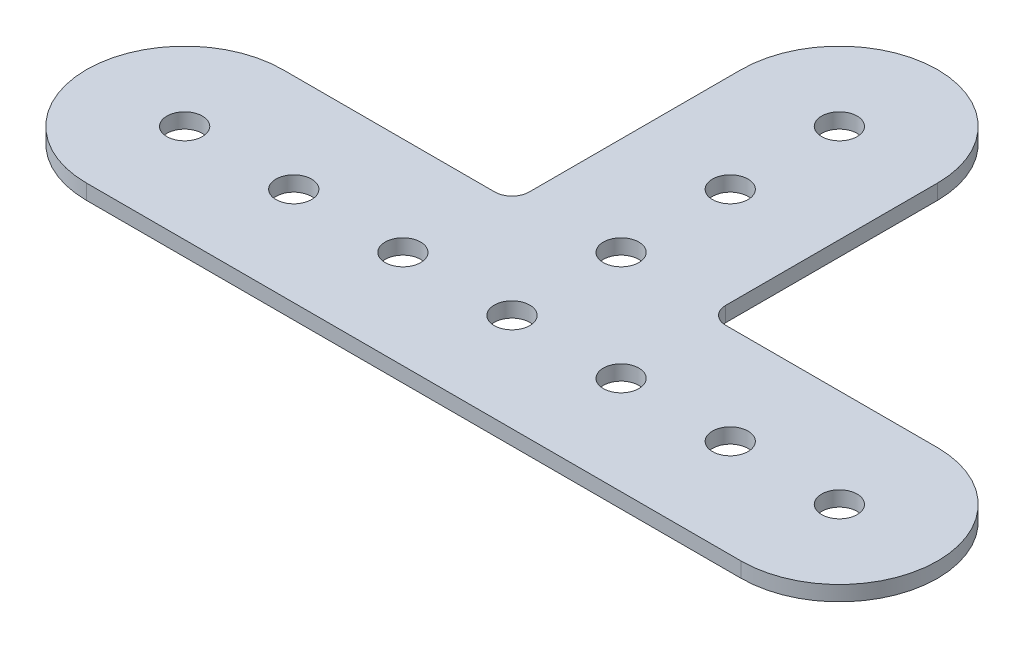
ISO-10303-21;
HEADER;
FILE_DESCRIPTION(('STEP AP214'),'2;1');
FILE_NAME('part.step','',(''),(''),'','','');
FILE_SCHEMA(('AUTOMOTIVE_DESIGN { 1 0 10303 214 1 1 1 1 }'));
ENDSEC;
DATA;
#1=APPLICATION_CONTEXT('core data for automotive mechanical design processes');
#2=APPLICATION_PROTOCOL_DEFINITION('international standard','automotive_design',2000,#1);
#3=PRODUCT_CONTEXT('',#1,'mechanical');
#4=PRODUCT('Part','Part','',(#3));
#5=PRODUCT_RELATED_PRODUCT_CATEGORY('part','',(#4));
#6=PRODUCT_DEFINITION_FORMATION('','',#4);
#7=PRODUCT_DEFINITION_CONTEXT('part definition',#1,'design');
#8=PRODUCT_DEFINITION('design','',#6,#7);
#9=PRODUCT_DEFINITION_SHAPE('','',#8);
#10=(LENGTH_UNIT() NAMED_UNIT(*) SI_UNIT(.MILLI.,.METRE.));
#11=(NAMED_UNIT(*) PLANE_ANGLE_UNIT() SI_UNIT($,.RADIAN.));
#12=(NAMED_UNIT(*) SI_UNIT($,.STERADIAN.) SOLID_ANGLE_UNIT());
#13=UNCERTAINTY_MEASURE_WITH_UNIT(LENGTH_MEASURE(1.E-05),#10,'distance_accuracy_value','');
#14=(GEOMETRIC_REPRESENTATION_CONTEXT(3) GLOBAL_UNCERTAINTY_ASSIGNED_CONTEXT((#13)) GLOBAL_UNIT_ASSIGNED_CONTEXT((#10,
#11,#12)) REPRESENTATION_CONTEXT('',''));
#15=CARTESIAN_POINT('',(0.,0.,0.));
#16=DIRECTION('',(0.,0.,1.));
#17=DIRECTION('',(1.,0.,0.));
#18=AXIS2_PLACEMENT_3D('',#15,#16,#17);
#19=CARTESIAN_POINT('',(11.4299999999999,0.875,0.));
#20=DIRECTION('',(1.,0.,0.));
#21=DIRECTION('',(0.,0.,-1.));
#22=AXIS2_PLACEMENT_3D('',#19,#20,#21);
#23=PLANE('',#22);
#24=DIRECTION('',(0.,0.,1.));
#25=VECTOR('',#24,1.);
#26=CARTESIAN_POINT('',(11.4299999999999,0.875,0.));
#27=LINE('',#26,#25);
#28=CARTESIAN_POINT('',(11.4299999999999,0.875,-38.1));
#29=VERTEX_POINT('',#28);
#30=CARTESIAN_POINT('',(11.4299999999999,0.875,-13.43));
#31=VERTEX_POINT('',#30);
#32=EDGE_CURVE('E119',#29,#31,#27,.T.);
#33=ORIENTED_EDGE('',*,*,#32,.T.);
#34=DIRECTION('',(0.,-1.,0.));
#35=VECTOR('',#34,1.);
#36=CARTESIAN_POINT('',(11.4299999999999,-0.875,-13.43));
#37=LINE('',#36,#35);
#38=CARTESIAN_POINT('',(11.4299999999999,-0.875,-13.43));
#39=VERTEX_POINT('',#38);
#40=EDGE_CURVE('E289',#31,#39,#37,.T.);
#41=ORIENTED_EDGE('',*,*,#40,.T.);
#42=DIRECTION('',(0.,0.,1.));
#43=VECTOR('',#42,1.);
#44=CARTESIAN_POINT('',(11.4299999999999,-0.875,0.));
#45=LINE('',#44,#43);
#46=CARTESIAN_POINT('',(11.4299999999999,-0.875,-38.1));
#47=VERTEX_POINT('',#46);
#48=EDGE_CURVE('E121',#47,#39,#45,.T.);
#49=ORIENTED_EDGE('',*,*,#48,.F.);
#50=DIRECTION('',(0.,-1.,0.));
#51=VECTOR('',#50,1.);
#52=CARTESIAN_POINT('',(11.4299999999999,0.875,-38.1));
#53=LINE('',#52,#51);
#54=EDGE_CURVE('E115',#29,#47,#53,.T.);
#55=ORIENTED_EDGE('',*,*,#54,.F.);
#56=EDGE_LOOP('',(#33,#41,#49,#55));
#57=FACE_BOUND('',#56,.T.);
#58=ADVANCED_FACE('F39',(#57),#23,.T.);
#59=CARTESIAN_POINT('',(-1.30692486857548E-13,0.875,-38.1));
#60=DIRECTION('',(0.,-1.,0.));
#61=DIRECTION('',(0.,0.,-1.));
#62=AXIS2_PLACEMENT_3D('',#59,#60,#61);
#63=CYLINDRICAL_SURFACE('',#62,11.43);
#64=CARTESIAN_POINT('',(-1.30692486857548E-13,-0.875,-38.1));
#65=DIRECTION('',(0.,1.,0.));
#66=DIRECTION('',(0.,0.,1.));
#67=AXIS2_PLACEMENT_3D('',#64,#65,#66);
#68=CIRCLE('',#67,11.43);
#69=CARTESIAN_POINT('',(-11.4300000000001,-0.875,-38.1));
#70=VERTEX_POINT('',#69);
#71=EDGE_CURVE('E210',#47,#70,#68,.T.);
#72=ORIENTED_EDGE('',*,*,#71,.T.);
#73=DIRECTION('',(0.,-1.,0.));
#74=VECTOR('',#73,1.);
#75=CARTESIAN_POINT('',(-11.4300000000001,0.875,-38.1));
#76=LINE('',#75,#74);
#77=CARTESIAN_POINT('',(-11.4300000000001,0.875,-38.1));
#78=VERTEX_POINT('',#77);
#79=EDGE_CURVE('E126',#78,#70,#76,.T.);
#80=ORIENTED_EDGE('',*,*,#79,.F.);
#81=CARTESIAN_POINT('',(-1.30692486857548E-13,0.875,-38.1));
#82=DIRECTION('',(0.,1.,0.));
#83=DIRECTION('',(0.,0.,1.));
#84=AXIS2_PLACEMENT_3D('',#81,#82,#83);
#85=CIRCLE('',#84,11.43);
#86=EDGE_CURVE('E129',#29,#78,#85,.T.);
#87=ORIENTED_EDGE('',*,*,#86,.F.);
#88=ORIENTED_EDGE('',*,*,#54,.T.);
#89=EDGE_LOOP('',(#72,#80,#87,#88));
#90=FACE_BOUND('',#89,.T.);
#91=ADVANCED_FACE('F130',(#90),#63,.T.);
#92=CARTESIAN_POINT('',(-11.4300000000001,0.875,0.));
#93=DIRECTION('',(1.,0.,0.));
#94=DIRECTION('',(0.,0.,-1.));
#95=AXIS2_PLACEMENT_3D('',#92,#93,#94);
#96=PLANE('',#95);
#97=DIRECTION('',(0.,0.,1.));
#98=VECTOR('',#97,1.);
#99=CARTESIAN_POINT('',(-11.4300000000001,-0.875,0.));
#100=LINE('',#99,#98);
#101=CARTESIAN_POINT('',(-11.4300000000001,-0.875,-13.43));
#102=VERTEX_POINT('',#101);
#103=EDGE_CURVE('E213',#70,#102,#100,.T.);
#104=ORIENTED_EDGE('',*,*,#103,.T.);
#105=DIRECTION('',(0.,-1.,0.));
#106=VECTOR('',#105,1.);
#107=CARTESIAN_POINT('',(-11.4300000000001,0.875,-13.43));
#108=LINE('',#107,#106);
#109=CARTESIAN_POINT('',(-11.4300000000001,0.875,-13.43));
#110=VERTEX_POINT('',#109);
#111=EDGE_CURVE('E286',#102,#110,#108,.F.);
#112=ORIENTED_EDGE('',*,*,#111,.T.);
#113=DIRECTION('',(0.,0.,1.));
#114=VECTOR('',#113,1.);
#115=CARTESIAN_POINT('',(-11.4300000000001,0.875,0.));
#116=LINE('',#115,#114);
#117=EDGE_CURVE('E136',#78,#110,#116,.T.);
#118=ORIENTED_EDGE('',*,*,#117,.F.);
#119=ORIENTED_EDGE('',*,*,#79,.T.);
#120=EDGE_LOOP('',(#104,#112,#118,#119));
#121=FACE_BOUND('',#120,.T.);
#122=ADVANCED_FACE('F318',(#121),#96,.F.);
#123=CARTESIAN_POINT('',(0.,0.875,-11.43));
#124=DIRECTION('',(0.,0.,-1.));
#125=DIRECTION('',(-1.,0.,0.));
#126=AXIS2_PLACEMENT_3D('',#123,#124,#125);
#127=PLANE('',#126);
#128=DIRECTION('',(1.,0.,0.));
#129=VECTOR('',#128,1.);
#130=CARTESIAN_POINT('',(0.,0.875,-11.43));
#131=LINE('',#130,#129);
#132=CARTESIAN_POINT('',(-38.1,0.875,-11.43));
#133=VERTEX_POINT('',#132);
#134=CARTESIAN_POINT('',(-13.4300000000001,0.875,-11.43));
#135=VERTEX_POINT('',#134);
#136=EDGE_CURVE('E151',#133,#135,#131,.T.);
#137=ORIENTED_EDGE('',*,*,#136,.T.);
#138=DIRECTION('',(0.,-1.,0.));
#139=VECTOR('',#138,1.);
#140=CARTESIAN_POINT('',(-13.4300000000001,0.875,-11.43));
#141=LINE('',#140,#139);
#142=CARTESIAN_POINT('',(-13.4300000000001,-0.875,-11.43));
#143=VERTEX_POINT('',#142);
#144=EDGE_CURVE('E125',#135,#143,#141,.T.);
#145=ORIENTED_EDGE('',*,*,#144,.T.);
#146=DIRECTION('',(1.,0.,0.));
#147=VECTOR('',#146,1.);
#148=CARTESIAN_POINT('',(0.,-0.875,-11.43));
#149=LINE('',#148,#147);
#150=CARTESIAN_POINT('',(-38.1,-0.875,-11.43));
#151=VERTEX_POINT('',#150);
#152=EDGE_CURVE('E217',#151,#143,#149,.T.);
#153=ORIENTED_EDGE('',*,*,#152,.F.);
#154=DIRECTION('',(0.,-1.,0.));
#155=VECTOR('',#154,1.);
#156=CARTESIAN_POINT('',(-38.1,0.875,-11.43));
#157=LINE('',#156,#155);
#158=EDGE_CURVE('E278',#133,#151,#157,.T.);
#159=ORIENTED_EDGE('',*,*,#158,.F.);
#160=EDGE_LOOP('',(#137,#145,#153,#159));
#161=FACE_BOUND('',#160,.T.);
#162=ADVANCED_FACE('F327',(#161),#127,.T.);
#163=CARTESIAN_POINT('',(-38.1,0.875,0.));
#164=DIRECTION('',(0.,-1.,0.));
#165=DIRECTION('',(0.,0.,-1.));
#166=AXIS2_PLACEMENT_3D('',#163,#164,#165);
#167=CYLINDRICAL_SURFACE('',#166,11.43);
#168=CARTESIAN_POINT('',(-38.1,-0.875,0.));
#169=DIRECTION('',(0.,1.,0.));
#170=DIRECTION('',(0.,0.,1.));
#171=AXIS2_PLACEMENT_3D('',#168,#169,#170);
#172=CIRCLE('',#171,11.43);
#173=CARTESIAN_POINT('',(-38.1,-0.875,11.43));
#174=VERTEX_POINT('',#173);
#175=EDGE_CURVE('E221',#174,#151,#172,.F.);
#176=ORIENTED_EDGE('',*,*,#175,.F.);
#177=DIRECTION('',(0.,-1.,0.));
#178=VECTOR('',#177,1.);
#179=CARTESIAN_POINT('',(-38.1,0.875,11.43));
#180=LINE('',#179,#178);
#181=CARTESIAN_POINT('',(-38.1,0.875,11.43));
#182=VERTEX_POINT('',#181);
#183=EDGE_CURVE('E275',#182,#174,#180,.T.);
#184=ORIENTED_EDGE('',*,*,#183,.F.);
#185=CARTESIAN_POINT('',(-38.1,0.875,0.));
#186=DIRECTION('',(0.,1.,0.));
#187=DIRECTION('',(0.,0.,1.));
#188=AXIS2_PLACEMENT_3D('',#185,#186,#187);
#189=CIRCLE('',#188,11.43);
#190=EDGE_CURVE('E155',#182,#133,#189,.F.);
#191=ORIENTED_EDGE('',*,*,#190,.T.);
#192=ORIENTED_EDGE('',*,*,#158,.T.);
#193=EDGE_LOOP('',(#176,#184,#191,#192));
#194=FACE_BOUND('',#193,.T.);
#195=ADVANCED_FACE('F329',(#194),#167,.T.);
#196=CARTESIAN_POINT('',(0.,0.875,11.43));
#197=DIRECTION('',(0.,0.,-1.));
#198=DIRECTION('',(-1.,0.,0.));
#199=AXIS2_PLACEMENT_3D('',#196,#197,#198);
#200=PLANE('',#199);
#201=DIRECTION('',(1.,0.,0.));
#202=VECTOR('',#201,1.);
#203=CARTESIAN_POINT('',(0.,-0.875,11.43));
#204=LINE('',#203,#202);
#205=CARTESIAN_POINT('',(38.1,-0.875,11.43));
#206=VERTEX_POINT('',#205);
#207=EDGE_CURVE('E226',#174,#206,#204,.T.);
#208=ORIENTED_EDGE('',*,*,#207,.T.);
#209=DIRECTION('',(0.,-1.,0.));
#210=VECTOR('',#209,1.);
#211=CARTESIAN_POINT('',(38.1,0.875,11.43));
#212=LINE('',#211,#210);
#213=CARTESIAN_POINT('',(38.1,0.875,11.43));
#214=VERTEX_POINT('',#213);
#215=EDGE_CURVE('E271',#214,#206,#212,.T.);
#216=ORIENTED_EDGE('',*,*,#215,.F.);
#217=DIRECTION('',(1.,0.,0.));
#218=VECTOR('',#217,1.);
#219=CARTESIAN_POINT('',(0.,0.875,11.43));
#220=LINE('',#219,#218);
#221=EDGE_CURVE('E160',#182,#214,#220,.T.);
#222=ORIENTED_EDGE('',*,*,#221,.F.);
#223=ORIENTED_EDGE('',*,*,#183,.T.);
#224=EDGE_LOOP('',(#208,#216,#222,#223));
#225=FACE_BOUND('',#224,.T.);
#226=ADVANCED_FACE('F331',(#225),#200,.F.);
#227=CARTESIAN_POINT('',(38.1,0.875,0.));
#228=DIRECTION('',(0.,-1.,0.));
#229=DIRECTION('',(0.,0.,-1.));
#230=AXIS2_PLACEMENT_3D('',#227,#228,#229);
#231=CYLINDRICAL_SURFACE('',#230,11.43);
#232=CARTESIAN_POINT('',(38.1,-0.875,0.));
#233=DIRECTION('',(0.,1.,0.));
#234=DIRECTION('',(0.,0.,1.));
#235=AXIS2_PLACEMENT_3D('',#232,#233,#234);
#236=CIRCLE('',#235,11.43);
#237=CARTESIAN_POINT('',(38.1,-0.875,-11.43));
#238=VERTEX_POINT('',#237);
#239=EDGE_CURVE('E229',#206,#238,#236,.T.);
#240=ORIENTED_EDGE('',*,*,#239,.T.);
#241=DIRECTION('',(0.,-1.,0.));
#242=VECTOR('',#241,1.);
#243=CARTESIAN_POINT('',(38.1,0.875,-11.43));
#244=LINE('',#243,#242);
#245=CARTESIAN_POINT('',(38.1,0.875,-11.43));
#246=VERTEX_POINT('',#245);
#247=EDGE_CURVE('E207',#246,#238,#244,.T.);
#248=ORIENTED_EDGE('',*,*,#247,.F.);
#249=CARTESIAN_POINT('',(38.1,0.875,0.));
#250=DIRECTION('',(0.,1.,0.));
#251=DIRECTION('',(0.,0.,1.));
#252=AXIS2_PLACEMENT_3D('',#249,#250,#251);
#253=CIRCLE('',#252,11.43);
#254=EDGE_CURVE('E163',#214,#246,#253,.T.);
#255=ORIENTED_EDGE('',*,*,#254,.F.);
#256=ORIENTED_EDGE('',*,*,#215,.T.);
#257=EDGE_LOOP('',(#240,#248,#255,#256));
#258=FACE_BOUND('',#257,.T.);
#259=ADVANCED_FACE('F308',(#258),#231,.T.);
#260=CARTESIAN_POINT('',(38.1,0.875,0.));
#261=DIRECTION('',(0.,-1.,0.));
#262=DIRECTION('',(0.,0.,-1.));
#263=AXIS2_PLACEMENT_3D('',#260,#261,#262);
#264=CYLINDRICAL_SURFACE('',#263,2.07);
#265=CARTESIAN_POINT('',(38.1,0.875,0.));
#266=DIRECTION('',(0.,1.,0.));
#267=DIRECTION('',(0.,0.,1.));
#268=AXIS2_PLACEMENT_3D('',#265,#266,#267);
#269=CIRCLE('',#268,2.07);
#270=CARTESIAN_POINT('',(38.1,0.875,2.07));
#271=VERTEX_POINT('',#270);
#272=EDGE_CURVE('E199',#271,#271,#269,.T.);
#273=ORIENTED_EDGE('',*,*,#272,.T.);
#274=EDGE_LOOP('',(#273));
#275=FACE_BOUND('',#274,.T.);
#276=CARTESIAN_POINT('',(38.1,-0.875,0.));
#277=DIRECTION('',(0.,1.,0.));
#278=DIRECTION('',(0.,0.,1.));
#279=AXIS2_PLACEMENT_3D('',#276,#277,#278);
#280=CIRCLE('',#279,2.07);
#281=CARTESIAN_POINT('',(38.1,-0.875,2.07));
#282=VERTEX_POINT('',#281);
#283=EDGE_CURVE('E146',#282,#282,#280,.T.);
#284=ORIENTED_EDGE('',*,*,#283,.F.);
#285=EDGE_LOOP('',(#284));
#286=FACE_BOUND('',#285,.T.);
#287=ADVANCED_FACE('F338',(#275,#286),#264,.F.);
#288=CARTESIAN_POINT('',(-12.7,0.875,0.));
#289=DIRECTION('',(0.,-1.,0.));
#290=DIRECTION('',(0.,0.,-1.));
#291=AXIS2_PLACEMENT_3D('',#288,#289,#290);
#292=CYLINDRICAL_SURFACE('',#291,2.07);
#293=CARTESIAN_POINT('',(-12.7,0.875,0.));
#294=DIRECTION('',(0.,1.,0.));
#295=DIRECTION('',(0.,0.,1.));
#296=AXIS2_PLACEMENT_3D('',#293,#294,#295);
#297=CIRCLE('',#296,2.07);
#298=CARTESIAN_POINT('',(-12.7,0.875,2.07));
#299=VERTEX_POINT('',#298);
#300=EDGE_CURVE('E195',#299,#299,#297,.F.);
#301=ORIENTED_EDGE('',*,*,#300,.F.);
#302=EDGE_LOOP('',(#301));
#303=FACE_BOUND('',#302,.T.);
#304=CARTESIAN_POINT('',(-12.7,-0.875,0.));
#305=DIRECTION('',(0.,1.,0.));
#306=DIRECTION('',(0.,0.,1.));
#307=AXIS2_PLACEMENT_3D('',#304,#305,#306);
#308=CIRCLE('',#307,2.07);
#309=CARTESIAN_POINT('',(-12.7,-0.875,2.07));
#310=VERTEX_POINT('',#309);
#311=EDGE_CURVE('E261',#310,#310,#308,.F.);
#312=ORIENTED_EDGE('',*,*,#311,.T.);
#313=EDGE_LOOP('',(#312));
#314=FACE_BOUND('',#313,.T.);
#315=ADVANCED_FACE('F365',(#303,#314),#292,.F.);
#316=CARTESIAN_POINT('',(12.7,0.875,0.));
#317=DIRECTION('',(0.,-1.,0.));
#318=DIRECTION('',(0.,0.,-1.));
#319=AXIS2_PLACEMENT_3D('',#316,#317,#318);
#320=CYLINDRICAL_SURFACE('',#319,2.07);
#321=CARTESIAN_POINT('',(12.7,0.875,0.));
#322=DIRECTION('',(0.,1.,0.));
#323=DIRECTION('',(0.,0.,1.));
#324=AXIS2_PLACEMENT_3D('',#321,#322,#323);
#325=CIRCLE('',#324,2.07);
#326=CARTESIAN_POINT('',(12.7,0.875,2.07));
#327=VERTEX_POINT('',#326);
#328=EDGE_CURVE('E191',#327,#327,#325,.T.);
#329=ORIENTED_EDGE('',*,*,#328,.T.);
#330=EDGE_LOOP('',(#329));
#331=FACE_BOUND('',#330,.T.);
#332=CARTESIAN_POINT('',(12.7,-0.875,0.));
#333=DIRECTION('',(0.,1.,0.));
#334=DIRECTION('',(0.,0.,1.));
#335=AXIS2_PLACEMENT_3D('',#332,#333,#334);
#336=CIRCLE('',#335,2.07);
#337=CARTESIAN_POINT('',(12.7,-0.875,2.07));
#338=VERTEX_POINT('',#337);
#339=EDGE_CURVE('E257',#338,#338,#336,.T.);
#340=ORIENTED_EDGE('',*,*,#339,.F.);
#341=EDGE_LOOP('',(#340));
#342=FACE_BOUND('',#341,.T.);
#343=ADVANCED_FACE('F369',(#331,#342),#320,.F.);
#344=CARTESIAN_POINT('',(0.,0.875,0.));
#345=DIRECTION('',(0.,-1.,0.));
#346=DIRECTION('',(0.,0.,-1.));
#347=AXIS2_PLACEMENT_3D('',#344,#345,#346);
#348=CYLINDRICAL_SURFACE('',#347,2.07);
#349=CARTESIAN_POINT('',(0.,0.875,0.));
#350=DIRECTION('',(0.,1.,0.));
#351=DIRECTION('',(0.,0.,1.));
#352=AXIS2_PLACEMENT_3D('',#349,#350,#351);
#353=CIRCLE('',#352,2.07);
#354=CARTESIAN_POINT('',(0.,0.875,2.07));
#355=VERTEX_POINT('',#354);
#356=EDGE_CURVE('E187',#355,#355,#353,.T.);
#357=ORIENTED_EDGE('',*,*,#356,.T.);
#358=EDGE_LOOP('',(#357));
#359=FACE_BOUND('',#358,.T.);
#360=CARTESIAN_POINT('',(0.,-0.875,0.));
#361=DIRECTION('',(0.,1.,0.));
#362=DIRECTION('',(0.,0.,1.));
#363=AXIS2_PLACEMENT_3D('',#360,#361,#362);
#364=CIRCLE('',#363,2.07);
#365=CARTESIAN_POINT('',(0.,-0.875,2.07));
#366=VERTEX_POINT('',#365);
#367=EDGE_CURVE('E253',#366,#366,#364,.T.);
#368=ORIENTED_EDGE('',*,*,#367,.F.);
#369=EDGE_LOOP('',(#368));
#370=FACE_BOUND('',#369,.T.);
#371=ADVANCED_FACE('F373',(#359,#370),#348,.F.);
#372=CARTESIAN_POINT('',(-38.1,0.875,0.));
#373=DIRECTION('',(0.,-1.,0.));
#374=DIRECTION('',(0.,0.,-1.));
#375=AXIS2_PLACEMENT_3D('',#372,#373,#374);
#376=CYLINDRICAL_SURFACE('',#375,2.07);
#377=CARTESIAN_POINT('',(-38.1,0.875,0.));
#378=DIRECTION('',(0.,1.,0.));
#379=DIRECTION('',(0.,0.,1.));
#380=AXIS2_PLACEMENT_3D('',#377,#378,#379);
#381=CIRCLE('',#380,2.07);
#382=CARTESIAN_POINT('',(-38.1,0.875,2.07));
#383=VERTEX_POINT('',#382);
#384=EDGE_CURVE('E183',#383,#383,#381,.F.);
#385=ORIENTED_EDGE('',*,*,#384,.F.);
#386=EDGE_LOOP('',(#385));
#387=FACE_BOUND('',#386,.T.);
#388=CARTESIAN_POINT('',(-38.1,-0.875,0.));
#389=DIRECTION('',(0.,1.,0.));
#390=DIRECTION('',(0.,0.,1.));
#391=AXIS2_PLACEMENT_3D('',#388,#389,#390);
#392=CIRCLE('',#391,2.07);
#393=CARTESIAN_POINT('',(-38.1,-0.875,2.07));
#394=VERTEX_POINT('',#393);
#395=EDGE_CURVE('E249',#394,#394,#392,.F.);
#396=ORIENTED_EDGE('',*,*,#395,.T.);
#397=EDGE_LOOP('',(#396));
#398=FACE_BOUND('',#397,.T.);
#399=ADVANCED_FACE('F377',(#387,#398),#376,.F.);
#400=CARTESIAN_POINT('',(-25.4,0.875,0.));
#401=DIRECTION('',(0.,-1.,0.));
#402=DIRECTION('',(0.,0.,-1.));
#403=AXIS2_PLACEMENT_3D('',#400,#401,#402);
#404=CYLINDRICAL_SURFACE('',#403,2.07);
#405=CARTESIAN_POINT('',(-25.4,0.875,0.));
#406=DIRECTION('',(0.,1.,0.));
#407=DIRECTION('',(0.,0.,1.));
#408=AXIS2_PLACEMENT_3D('',#405,#406,#407);
#409=CIRCLE('',#408,2.07);
#410=CARTESIAN_POINT('',(-25.4,0.875,2.07));
#411=VERTEX_POINT('',#410);
#412=EDGE_CURVE('E179',#411,#411,#409,.F.);
#413=ORIENTED_EDGE('',*,*,#412,.F.);
#414=EDGE_LOOP('',(#413));
#415=FACE_BOUND('',#414,.T.);
#416=CARTESIAN_POINT('',(-25.4,-0.875,0.));
#417=DIRECTION('',(0.,1.,0.));
#418=DIRECTION('',(0.,0.,1.));
#419=AXIS2_PLACEMENT_3D('',#416,#417,#418);
#420=CIRCLE('',#419,2.07);
#421=CARTESIAN_POINT('',(-25.4,-0.875,2.07));
#422=VERTEX_POINT('',#421);
#423=EDGE_CURVE('E245',#422,#422,#420,.F.);
#424=ORIENTED_EDGE('',*,*,#423,.T.);
#425=EDGE_LOOP('',(#424));
#426=FACE_BOUND('',#425,.T.);
#427=ADVANCED_FACE('F381',(#415,#426),#404,.F.);
#428=CARTESIAN_POINT('',(0.,0.875,-12.7));
#429=DIRECTION('',(0.,-1.,0.));
#430=DIRECTION('',(0.,0.,-1.));
#431=AXIS2_PLACEMENT_3D('',#428,#429,#430);
#432=CYLINDRICAL_SURFACE('',#431,2.07);
#433=CARTESIAN_POINT('',(0.,0.875,-12.7));
#434=DIRECTION('',(0.,1.,0.));
#435=DIRECTION('',(0.,0.,1.));
#436=AXIS2_PLACEMENT_3D('',#433,#434,#435);
#437=CIRCLE('',#436,2.07);
#438=CARTESIAN_POINT('',(0.,0.875,-10.63));
#439=VERTEX_POINT('',#438);
#440=EDGE_CURVE('E175',#439,#439,#437,.T.);
#441=ORIENTED_EDGE('',*,*,#440,.T.);
#442=EDGE_LOOP('',(#441));
#443=FACE_BOUND('',#442,.T.);
#444=CARTESIAN_POINT('',(0.,-0.875,-12.7));
#445=DIRECTION('',(0.,1.,0.));
#446=DIRECTION('',(0.,0.,1.));
#447=AXIS2_PLACEMENT_3D('',#444,#445,#446);
#448=CIRCLE('',#447,2.07);
#449=CARTESIAN_POINT('',(0.,-0.875,-10.63));
#450=VERTEX_POINT('',#449);
#451=EDGE_CURVE('E241',#450,#450,#448,.T.);
#452=ORIENTED_EDGE('',*,*,#451,.F.);
#453=EDGE_LOOP('',(#452));
#454=FACE_BOUND('',#453,.T.);
#455=ADVANCED_FACE('F385',(#443,#454),#432,.F.);
#456=CARTESIAN_POINT('',(0.,0.875,-25.4));
#457=DIRECTION('',(0.,-1.,0.));
#458=DIRECTION('',(0.,0.,-1.));
#459=AXIS2_PLACEMENT_3D('',#456,#457,#458);
#460=CYLINDRICAL_SURFACE('',#459,2.07);
#461=CARTESIAN_POINT('',(0.,0.875,-25.4));
#462=DIRECTION('',(0.,1.,0.));
#463=DIRECTION('',(0.,0.,1.));
#464=AXIS2_PLACEMENT_3D('',#461,#462,#463);
#465=CIRCLE('',#464,2.07);
#466=CARTESIAN_POINT('',(0.,0.875,-23.33));
#467=VERTEX_POINT('',#466);
#468=EDGE_CURVE('E171',#467,#467,#465,.T.);
#469=ORIENTED_EDGE('',*,*,#468,.T.);
#470=EDGE_LOOP('',(#469));
#471=FACE_BOUND('',#470,.T.);
#472=CARTESIAN_POINT('',(0.,-0.875,-25.4));
#473=DIRECTION('',(0.,1.,0.));
#474=DIRECTION('',(0.,0.,1.));
#475=AXIS2_PLACEMENT_3D('',#472,#473,#474);
#476=CIRCLE('',#475,2.07);
#477=CARTESIAN_POINT('',(0.,-0.875,-23.33));
#478=VERTEX_POINT('',#477);
#479=EDGE_CURVE('E237',#478,#478,#476,.T.);
#480=ORIENTED_EDGE('',*,*,#479,.F.);
#481=EDGE_LOOP('',(#480));
#482=FACE_BOUND('',#481,.T.);
#483=ADVANCED_FACE('F389',(#471,#482),#460,.F.);
#484=CARTESIAN_POINT('',(25.4,0.875,0.));
#485=DIRECTION('',(0.,-1.,0.));
#486=DIRECTION('',(0.,0.,-1.));
#487=AXIS2_PLACEMENT_3D('',#484,#485,#486);
#488=CYLINDRICAL_SURFACE('',#487,2.07);
#489=CARTESIAN_POINT('',(25.4,0.875,0.));
#490=DIRECTION('',(0.,1.,0.));
#491=DIRECTION('',(0.,0.,1.));
#492=AXIS2_PLACEMENT_3D('',#489,#490,#491);
#493=CIRCLE('',#492,2.07);
#494=CARTESIAN_POINT('',(25.4,0.875,2.07));
#495=VERTEX_POINT('',#494);
#496=EDGE_CURVE('E167',#495,#495,#493,.T.);
#497=ORIENTED_EDGE('',*,*,#496,.T.);
#498=EDGE_LOOP('',(#497));
#499=FACE_BOUND('',#498,.T.);
#500=CARTESIAN_POINT('',(25.4,-0.875,0.));
#501=DIRECTION('',(0.,1.,0.));
#502=DIRECTION('',(0.,0.,1.));
#503=AXIS2_PLACEMENT_3D('',#500,#501,#502);
#504=CIRCLE('',#503,2.07);
#505=CARTESIAN_POINT('',(25.4,-0.875,2.07));
#506=VERTEX_POINT('',#505);
#507=EDGE_CURVE('E233',#506,#506,#504,.T.);
#508=ORIENTED_EDGE('',*,*,#507,.F.);
#509=EDGE_LOOP('',(#508));
#510=FACE_BOUND('',#509,.T.);
#511=ADVANCED_FACE('F393',(#499,#510),#488,.F.);
#512=CARTESIAN_POINT('',(13.4299999999999,-0.875,-11.43));
#513=VERTEX_POINT('',#512);
#514=EDGE_CURVE('E222',#513,#238,#149,.T.);
#515=ORIENTED_EDGE('',*,*,#514,.F.);
#516=DIRECTION('',(0.,-1.,0.));
#517=VECTOR('',#516,1.);
#518=CARTESIAN_POINT('',(13.4299999999999,0.875,-11.43));
#519=LINE('',#518,#517);
#520=CARTESIAN_POINT('',(13.4299999999999,0.875,-11.43));
#521=VERTEX_POINT('',#520);
#522=EDGE_CURVE('E55',#513,#521,#519,.F.);
#523=ORIENTED_EDGE('',*,*,#522,.T.);
#524=EDGE_CURVE('E156',#521,#246,#131,.T.);
#525=ORIENTED_EDGE('',*,*,#524,.T.);
#526=ORIENTED_EDGE('',*,*,#247,.T.);
#527=EDGE_LOOP('',(#515,#523,#525,#526));
#528=FACE_BOUND('',#527,.T.);
#529=ADVANCED_FACE('F301',(#528),#127,.T.);
#530=CARTESIAN_POINT('',(-1.30692486857548E-13,0.875,-38.1));
#531=DIRECTION('',(0.,-1.,0.));
#532=DIRECTION('',(0.,0.,-1.));
#533=AXIS2_PLACEMENT_3D('',#530,#531,#532);
#534=CYLINDRICAL_SURFACE('',#533,2.07);
#535=CARTESIAN_POINT('',(-1.30692486857548E-13,0.875,-38.1));
#536=DIRECTION('',(0.,1.,0.));
#537=DIRECTION('',(0.,0.,1.));
#538=AXIS2_PLACEMENT_3D('',#535,#536,#537);
#539=CIRCLE('',#538,2.07);
#540=CARTESIAN_POINT('',(-1.30692486857548E-13,0.875,-36.03));
#541=VERTEX_POINT('',#540);
#542=EDGE_CURVE('E203',#541,#541,#539,.T.);
#543=ORIENTED_EDGE('',*,*,#542,.T.);
#544=EDGE_LOOP('',(#543));
#545=FACE_BOUND('',#544,.T.);
#546=CARTESIAN_POINT('',(-1.30692486857548E-13,-0.875,-38.1));
#547=DIRECTION('',(0.,1.,0.));
#548=DIRECTION('',(0.,0.,1.));
#549=AXIS2_PLACEMENT_3D('',#546,#547,#548);
#550=CIRCLE('',#549,2.07);
#551=CARTESIAN_POINT('',(-1.30692486857548E-13,-0.875,-36.03));
#552=VERTEX_POINT('',#551);
#553=EDGE_CURVE('E142',#552,#552,#550,.T.);
#554=ORIENTED_EDGE('',*,*,#553,.F.);
#555=EDGE_LOOP('',(#554));
#556=FACE_BOUND('',#555,.T.);
#557=ADVANCED_FACE('F357',(#545,#556),#534,.F.);
#558=CARTESIAN_POINT('',(0.,0.875,0.));
#559=DIRECTION('',(0.,1.,0.));
#560=DIRECTION('',(0.,0.,1.));
#561=AXIS2_PLACEMENT_3D('',#558,#559,#560);
#562=PLANE('',#561);
#563=ORIENTED_EDGE('',*,*,#32,.F.);
#564=ORIENTED_EDGE('',*,*,#86,.T.);
#565=ORIENTED_EDGE('',*,*,#117,.T.);
#566=CARTESIAN_POINT('',(-13.4300000000001,0.875,-13.43));
#567=DIRECTION('',(0.,1.,0.));
#568=DIRECTION('',(0.,0.,1.));
#569=AXIS2_PLACEMENT_3D('',#566,#567,#568);
#570=CIRCLE('',#569,2.);
#571=EDGE_CURVE('E297',#110,#135,#570,.F.);
#572=ORIENTED_EDGE('',*,*,#571,.T.);
#573=ORIENTED_EDGE('',*,*,#136,.F.);
#574=ORIENTED_EDGE('',*,*,#190,.F.);
#575=ORIENTED_EDGE('',*,*,#221,.T.);
#576=ORIENTED_EDGE('',*,*,#254,.T.);
#577=ORIENTED_EDGE('',*,*,#524,.F.);
#578=CARTESIAN_POINT('',(13.4299999999999,0.875,-13.43));
#579=DIRECTION('',(0.,1.,0.));
#580=DIRECTION('',(0.,0.,1.));
#581=AXIS2_PLACEMENT_3D('',#578,#579,#580);
#582=CIRCLE('',#581,2.);
#583=EDGE_CURVE('E11',#521,#31,#582,.F.);
#584=ORIENTED_EDGE('',*,*,#583,.T.);
#585=EDGE_LOOP('',(#563,#564,#565,#572,#573,#574,#575,#576,#577,#584));
#586=FACE_BOUND('',#585,.T.);
#587=ORIENTED_EDGE('',*,*,#496,.F.);
#588=EDGE_LOOP('',(#587));
#589=FACE_BOUND('',#588,.T.);
#590=ORIENTED_EDGE('',*,*,#468,.F.);
#591=EDGE_LOOP('',(#590));
#592=FACE_BOUND('',#591,.T.);
#593=ORIENTED_EDGE('',*,*,#440,.F.);
#594=EDGE_LOOP('',(#593));
#595=FACE_BOUND('',#594,.T.);
#596=ORIENTED_EDGE('',*,*,#412,.T.);
#597=EDGE_LOOP('',(#596));
#598=FACE_BOUND('',#597,.T.);
#599=ORIENTED_EDGE('',*,*,#384,.T.);
#600=EDGE_LOOP('',(#599));
#601=FACE_BOUND('',#600,.T.);
#602=ORIENTED_EDGE('',*,*,#356,.F.);
#603=EDGE_LOOP('',(#602));
#604=FACE_BOUND('',#603,.T.);
#605=ORIENTED_EDGE('',*,*,#328,.F.);
#606=EDGE_LOOP('',(#605));
#607=FACE_BOUND('',#606,.T.);
#608=ORIENTED_EDGE('',*,*,#300,.T.);
#609=EDGE_LOOP('',(#608));
#610=FACE_BOUND('',#609,.T.);
#611=ORIENTED_EDGE('',*,*,#272,.F.);
#612=EDGE_LOOP('',(#611));
#613=FACE_BOUND('',#612,.T.);
#614=ORIENTED_EDGE('',*,*,#542,.F.);
#615=EDGE_LOOP('',(#614));
#616=FACE_BOUND('',#615,.T.);
#617=ADVANCED_FACE('F138',(#586,#589,#592,#595,#598,#601,#604,#607,#610,#613,#616),#562,.T.);
#618=CARTESIAN_POINT('',(0.,-0.875,0.));
#619=DIRECTION('',(0.,1.,0.));
#620=DIRECTION('',(0.,0.,1.));
#621=AXIS2_PLACEMENT_3D('',#618,#619,#620);
#622=PLANE('',#621);
#623=ORIENTED_EDGE('',*,*,#48,.T.);
#624=CARTESIAN_POINT('',(13.4299999999999,-0.875,-13.43));
#625=DIRECTION('',(0.,1.,0.));
#626=DIRECTION('',(0.,0.,1.));
#627=AXIS2_PLACEMENT_3D('',#624,#625,#626);
#628=CIRCLE('',#627,2.);
#629=EDGE_CURVE('E48',#39,#513,#628,.T.);
#630=ORIENTED_EDGE('',*,*,#629,.T.);
#631=ORIENTED_EDGE('',*,*,#514,.T.);
#632=ORIENTED_EDGE('',*,*,#239,.F.);
#633=ORIENTED_EDGE('',*,*,#207,.F.);
#634=ORIENTED_EDGE('',*,*,#175,.T.);
#635=ORIENTED_EDGE('',*,*,#152,.T.);
#636=CARTESIAN_POINT('',(-13.4300000000001,-0.875,-13.43));
#637=DIRECTION('',(0.,1.,0.));
#638=DIRECTION('',(0.,0.,1.));
#639=AXIS2_PLACEMENT_3D('',#636,#637,#638);
#640=CIRCLE('',#639,2.);
#641=EDGE_CURVE('E294',#143,#102,#640,.T.);
#642=ORIENTED_EDGE('',*,*,#641,.T.);
#643=ORIENTED_EDGE('',*,*,#103,.F.);
#644=ORIENTED_EDGE('',*,*,#71,.F.);
#645=EDGE_LOOP('',(#623,#630,#631,#632,#633,#634,#635,#642,#643,#644));
#646=FACE_BOUND('',#645,.T.);
#647=ORIENTED_EDGE('',*,*,#507,.T.);
#648=EDGE_LOOP('',(#647));
#649=FACE_BOUND('',#648,.T.);
#650=ORIENTED_EDGE('',*,*,#479,.T.);
#651=EDGE_LOOP('',(#650));
#652=FACE_BOUND('',#651,.T.);
#653=ORIENTED_EDGE('',*,*,#451,.T.);
#654=EDGE_LOOP('',(#653));
#655=FACE_BOUND('',#654,.T.);
#656=ORIENTED_EDGE('',*,*,#423,.F.);
#657=EDGE_LOOP('',(#656));
#658=FACE_BOUND('',#657,.T.);
#659=ORIENTED_EDGE('',*,*,#395,.F.);
#660=EDGE_LOOP('',(#659));
#661=FACE_BOUND('',#660,.T.);
#662=ORIENTED_EDGE('',*,*,#367,.T.);
#663=EDGE_LOOP('',(#662));
#664=FACE_BOUND('',#663,.T.);
#665=ORIENTED_EDGE('',*,*,#339,.T.);
#666=EDGE_LOOP('',(#665));
#667=FACE_BOUND('',#666,.T.);
#668=ORIENTED_EDGE('',*,*,#311,.F.);
#669=EDGE_LOOP('',(#668));
#670=FACE_BOUND('',#669,.T.);
#671=ORIENTED_EDGE('',*,*,#283,.T.);
#672=EDGE_LOOP('',(#671));
#673=FACE_BOUND('',#672,.T.);
#674=ORIENTED_EDGE('',*,*,#553,.T.);
#675=EDGE_LOOP('',(#674));
#676=FACE_BOUND('',#675,.T.);
#677=ADVANCED_FACE('F311',(#646,#649,#652,#655,#658,#661,#664,#667,#670,#673,#676),#622,.F.);
#678=CARTESIAN_POINT('',(-13.4300000000001,0.875,-13.43));
#679=DIRECTION('',(0.,-1.,0.));
#680=DIRECTION('',(0.,0.,-1.));
#681=AXIS2_PLACEMENT_3D('',#678,#679,#680);
#682=CYLINDRICAL_SURFACE('',#681,2.);
#683=ORIENTED_EDGE('',*,*,#571,.F.);
#684=ORIENTED_EDGE('',*,*,#111,.F.);
#685=ORIENTED_EDGE('',*,*,#641,.F.);
#686=ORIENTED_EDGE('',*,*,#144,.F.);
#687=EDGE_LOOP('',(#683,#684,#685,#686));
#688=FACE_BOUND('',#687,.T.);
#689=ADVANCED_FACE('F324',(#688),#682,.F.);
#690=CARTESIAN_POINT('',(13.4299999999999,0.875,-13.43));
#691=DIRECTION('',(0.,1.,0.));
#692=DIRECTION('',(0.,0.,1.));
#693=AXIS2_PLACEMENT_3D('',#690,#691,#692);
#694=CYLINDRICAL_SURFACE('',#693,2.);
#695=ORIENTED_EDGE('',*,*,#583,.F.);
#696=ORIENTED_EDGE('',*,*,#522,.F.);
#697=ORIENTED_EDGE('',*,*,#629,.F.);
#698=ORIENTED_EDGE('',*,*,#40,.F.);
#699=EDGE_LOOP('',(#695,#696,#697,#698));
#700=FACE_BOUND('',#699,.T.);
#701=ADVANCED_FACE('F41',(#700),#694,.F.);
#702=CLOSED_SHELL('',(#58,#91,#122,#162,#195,#226,#259,#287,#315,#343,#371,#399,#427,#455,#483,
#511,#529,#557,#617,#677,#689,#701));
#703=MANIFOLD_SOLID_BREP('B2',#702);
#704=ADVANCED_BREP_SHAPE_REPRESENTATION('',(#18,#703),#14);
#705=SHAPE_DEFINITION_REPRESENTATION(#9,#704);
ENDSEC;
END-ISO-10303-21;
